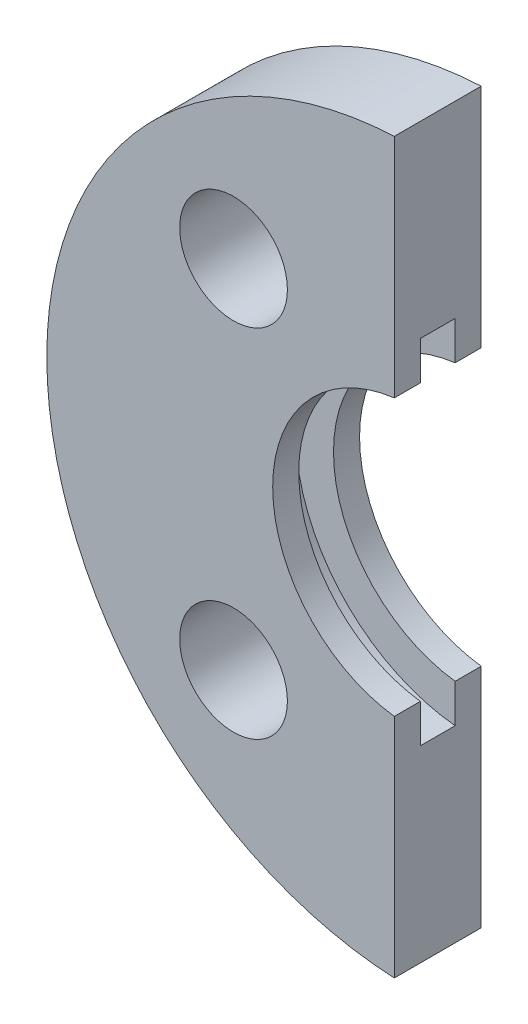
ISO-10303-21;
HEADER;
FILE_DESCRIPTION(('STEP AP214'),'2;1');
FILE_NAME('part.step','',(''),(''),'','','');
FILE_SCHEMA(('AUTOMOTIVE_DESIGN { 1 0 10303 214 1 1 1 1 }'));
ENDSEC;
DATA;
#1=APPLICATION_CONTEXT('core data for automotive mechanical design processes');
#2=APPLICATION_PROTOCOL_DEFINITION('international standard','automotive_design',2000,#1);
#3=PRODUCT_CONTEXT('',#1,'mechanical');
#4=PRODUCT('Part','Part','',(#3));
#5=PRODUCT_RELATED_PRODUCT_CATEGORY('part','',(#4));
#6=PRODUCT_DEFINITION_FORMATION('','',#4);
#7=PRODUCT_DEFINITION_CONTEXT('part definition',#1,'design');
#8=PRODUCT_DEFINITION('design','',#6,#7);
#9=PRODUCT_DEFINITION_SHAPE('','',#8);
#10=(LENGTH_UNIT() NAMED_UNIT(*) SI_UNIT(.MILLI.,.METRE.));
#11=(NAMED_UNIT(*) PLANE_ANGLE_UNIT() SI_UNIT($,.RADIAN.));
#12=(NAMED_UNIT(*) SI_UNIT($,.STERADIAN.) SOLID_ANGLE_UNIT());
#13=UNCERTAINTY_MEASURE_WITH_UNIT(LENGTH_MEASURE(1.E-05),#10,'distance_accuracy_value','');
#14=(GEOMETRIC_REPRESENTATION_CONTEXT(3) GLOBAL_UNCERTAINTY_ASSIGNED_CONTEXT((#13)) GLOBAL_UNIT_ASSIGNED_CONTEXT((#10,
#11,#12)) REPRESENTATION_CONTEXT('',''));
#15=CARTESIAN_POINT('',(0.,0.,0.));
#16=DIRECTION('',(0.,0.,1.));
#17=DIRECTION('',(1.,0.,0.));
#18=AXIS2_PLACEMENT_3D('',#15,#16,#17);
#19=CARTESIAN_POINT('',(0.,0.,5.));
#20=DIRECTION('',(0.,0.,-1.));
#21=DIRECTION('',(-1.,0.,0.));
#22=AXIS2_PLACEMENT_3D('',#19,#20,#21);
#23=CYLINDRICAL_SURFACE('',#22,8.);
#24=CARTESIAN_POINT('',(0.,0.,1.5));
#25=DIRECTION('',(0.,0.,-1.));
#26=DIRECTION('',(-1.,0.,0.));
#27=AXIS2_PLACEMENT_3D('',#24,#25,#26);
#28=CIRCLE('',#27,8.);
#29=CARTESIAN_POINT('',(-1.,-7.93725393319377,1.5));
#30=VERTEX_POINT('',#29);
#31=CARTESIAN_POINT('',(-1.,7.93725393319377,1.5));
#32=VERTEX_POINT('',#31);
#33=EDGE_CURVE('E118',#30,#32,#28,.T.);
#34=ORIENTED_EDGE('',*,*,#33,.F.);
#35=DIRECTION('',(0.,0.,-1.));
#36=VECTOR('',#35,1.);
#37=CARTESIAN_POINT('',(-1.,-7.93725393319377,5.));
#38=LINE('',#37,#36);
#39=CARTESIAN_POINT('',(-1.,-7.93725393319377,0.));
#40=VERTEX_POINT('',#39);
#41=EDGE_CURVE('E195',#40,#30,#38,.F.);
#42=ORIENTED_EDGE('',*,*,#41,.F.);
#43=CARTESIAN_POINT('',(0.,0.,0.));
#44=DIRECTION('',(0.,0.,1.));
#45=DIRECTION('',(1.,0.,0.));
#46=AXIS2_PLACEMENT_3D('',#43,#44,#45);
#47=CIRCLE('',#46,8.);
#48=CARTESIAN_POINT('',(-1.,7.93725393319377,0.));
#49=VERTEX_POINT('',#48);
#50=EDGE_CURVE('E175',#49,#40,#47,.T.);
#51=ORIENTED_EDGE('',*,*,#50,.F.);
#52=DIRECTION('',(0.,0.,-1.));
#53=VECTOR('',#52,1.);
#54=CARTESIAN_POINT('',(-1.,7.93725393319377,5.));
#55=LINE('',#54,#53);
#56=EDGE_CURVE('E198',#32,#49,#55,.T.);
#57=ORIENTED_EDGE('',*,*,#56,.F.);
#58=EDGE_LOOP('',(#34,#42,#51,#57));
#59=FACE_BOUND('',#58,.T.);
#60=ADVANCED_FACE('F45',(#59),#23,.F.);
#61=CARTESIAN_POINT('',(0.,0.,5.));
#62=DIRECTION('',(0.,0.,1.));
#63=DIRECTION('',(1.,0.,0.));
#64=AXIS2_PLACEMENT_3D('',#61,#62,#63);
#65=PLANE('',#64);
#66=DIRECTION('',(0.,-1.,0.));
#67=VECTOR('',#66,1.);
#68=CARTESIAN_POINT('',(-1.,0.,5.));
#69=LINE('',#68,#67);
#70=CARTESIAN_POINT('',(-1.,20.976176963403,5.));
#71=VERTEX_POINT('',#70);
#72=CARTESIAN_POINT('',(-1.,7.93725393319377,5.));
#73=VERTEX_POINT('',#72);
#74=EDGE_CURVE('E69',#71,#73,#69,.T.);
#75=ORIENTED_EDGE('',*,*,#74,.F.);
#76=CARTESIAN_POINT('',(0.,0.,5.));
#77=DIRECTION('',(0.,0.,1.));
#78=DIRECTION('',(1.,0.,0.));
#79=AXIS2_PLACEMENT_3D('',#76,#77,#78);
#80=CIRCLE('',#79,21.);
#81=CARTESIAN_POINT('',(-1.,-20.976176963403,5.));
#82=VERTEX_POINT('',#81);
#83=EDGE_CURVE('E187',#71,#82,#80,.T.);
#84=ORIENTED_EDGE('',*,*,#83,.T.);
#85=CARTESIAN_POINT('',(-1.,-7.93725393319377,5.));
#86=VERTEX_POINT('',#85);
#87=EDGE_CURVE('E148',#86,#82,#69,.T.);
#88=ORIENTED_EDGE('',*,*,#87,.F.);
#89=CARTESIAN_POINT('',(0.,0.,5.));
#90=DIRECTION('',(0.,0.,1.));
#91=DIRECTION('',(1.,0.,0.));
#92=AXIS2_PLACEMENT_3D('',#89,#90,#91);
#93=CIRCLE('',#92,8.);
#94=EDGE_CURVE('E179',#73,#86,#93,.T.);
#95=ORIENTED_EDGE('',*,*,#94,.F.);
#96=EDGE_LOOP('',(#75,#84,#88,#95));
#97=FACE_BOUND('',#96,.T.);
#98=CARTESIAN_POINT('',(-10.2530483272049,-10.2530483272049,5.));
#99=DIRECTION('',(0.,0.,1.));
#100=DIRECTION('',(1.,0.,0.));
#101=AXIS2_PLACEMENT_3D('',#98,#99,#100);
#102=CIRCLE('',#101,3.1);
#103=CARTESIAN_POINT('',(-7.15304832720494,-10.2530483272049,5.));
#104=VERTEX_POINT('',#103);
#105=EDGE_CURVE('E171',#104,#104,#102,.T.);
#106=ORIENTED_EDGE('',*,*,#105,.F.);
#107=EDGE_LOOP('',(#106));
#108=FACE_BOUND('',#107,.T.);
#109=CARTESIAN_POINT('',(-10.2530483272049,10.2530483272049,5.));
#110=DIRECTION('',(0.,0.,1.));
#111=DIRECTION('',(1.,0.,0.));
#112=AXIS2_PLACEMENT_3D('',#109,#110,#111);
#113=CIRCLE('',#112,3.1);
#114=CARTESIAN_POINT('',(-7.15304832720494,10.2530483272049,5.));
#115=VERTEX_POINT('',#114);
#116=EDGE_CURVE('E163',#115,#115,#113,.T.);
#117=ORIENTED_EDGE('',*,*,#116,.F.);
#118=EDGE_LOOP('',(#117));
#119=FACE_BOUND('',#118,.T.);
#120=ADVANCED_FACE('F226',(#97,#108,#119),#65,.T.);
#121=CARTESIAN_POINT('',(0.,0.,0.));
#122=DIRECTION('',(0.,0.,1.));
#123=DIRECTION('',(1.,0.,0.));
#124=AXIS2_PLACEMENT_3D('',#121,#122,#123);
#125=PLANE('',#124);
#126=CARTESIAN_POINT('',(0.,0.,0.));
#127=DIRECTION('',(0.,0.,1.));
#128=DIRECTION('',(1.,0.,0.));
#129=AXIS2_PLACEMENT_3D('',#126,#127,#128);
#130=CIRCLE('',#129,21.);
#131=CARTESIAN_POINT('',(-1.,20.976176963403,0.));
#132=VERTEX_POINT('',#131);
#133=CARTESIAN_POINT('',(-1.,-20.976176963403,0.));
#134=VERTEX_POINT('',#133);
#135=EDGE_CURVE('E183',#132,#134,#130,.T.);
#136=ORIENTED_EDGE('',*,*,#135,.F.);
#137=DIRECTION('',(0.,-1.,0.));
#138=VECTOR('',#137,1.);
#139=CARTESIAN_POINT('',(-1.,0.,0.));
#140=LINE('',#139,#138);
#141=EDGE_CURVE('E154',#132,#49,#140,.T.);
#142=ORIENTED_EDGE('',*,*,#141,.T.);
#143=ORIENTED_EDGE('',*,*,#50,.T.);
#144=EDGE_CURVE('E61',#40,#134,#140,.T.);
#145=ORIENTED_EDGE('',*,*,#144,.T.);
#146=EDGE_LOOP('',(#136,#142,#143,#145));
#147=FACE_BOUND('',#146,.T.);
#148=CARTESIAN_POINT('',(-10.2530483272049,-10.2530483272049,0.));
#149=DIRECTION('',(0.,0.,1.));
#150=DIRECTION('',(1.,0.,0.));
#151=AXIS2_PLACEMENT_3D('',#148,#149,#150);
#152=CIRCLE('',#151,3.1);
#153=CARTESIAN_POINT('',(-7.15304832720494,-10.2530483272049,0.));
#154=VERTEX_POINT('',#153);
#155=EDGE_CURVE('E167',#154,#154,#152,.T.);
#156=ORIENTED_EDGE('',*,*,#155,.T.);
#157=EDGE_LOOP('',(#156));
#158=FACE_BOUND('',#157,.T.);
#159=CARTESIAN_POINT('',(-10.2530483272049,10.2530483272049,0.));
#160=DIRECTION('',(0.,0.,1.));
#161=DIRECTION('',(1.,0.,0.));
#162=AXIS2_PLACEMENT_3D('',#159,#160,#161);
#163=CIRCLE('',#162,3.1);
#164=CARTESIAN_POINT('',(-7.15304832720494,10.2530483272049,0.));
#165=VERTEX_POINT('',#164);
#166=EDGE_CURVE('E162',#165,#165,#163,.T.);
#167=ORIENTED_EDGE('',*,*,#166,.T.);
#168=EDGE_LOOP('',(#167));
#169=FACE_BOUND('',#168,.T.);
#170=ADVANCED_FACE('F206',(#147,#158,#169),#125,.F.);
#171=CARTESIAN_POINT('',(0.,0.,5.));
#172=DIRECTION('',(0.,0.,-1.));
#173=DIRECTION('',(-1.,0.,0.));
#174=AXIS2_PLACEMENT_3D('',#171,#172,#173);
#175=CYLINDRICAL_SURFACE('',#174,21.);
#176=ORIENTED_EDGE('',*,*,#83,.F.);
#177=DIRECTION('',(0.,0.,-1.));
#178=VECTOR('',#177,1.);
#179=CARTESIAN_POINT('',(-1.,20.976176963403,5.));
#180=LINE('',#179,#178);
#181=EDGE_CURVE('E158',#71,#132,#180,.T.);
#182=ORIENTED_EDGE('',*,*,#181,.T.);
#183=ORIENTED_EDGE('',*,*,#135,.T.);
#184=DIRECTION('',(0.,0.,-1.));
#185=VECTOR('',#184,1.);
#186=CARTESIAN_POINT('',(-1.,-20.976176963403,5.));
#187=LINE('',#186,#185);
#188=EDGE_CURVE('E153',#134,#82,#187,.F.);
#189=ORIENTED_EDGE('',*,*,#188,.T.);
#190=EDGE_LOOP('',(#176,#182,#183,#189));
#191=FACE_BOUND('',#190,.T.);
#192=ADVANCED_FACE('F47',(#191),#175,.T.);
#193=CARTESIAN_POINT('',(-1.,-7.93725393319377,3.5));
#194=VERTEX_POINT('',#193);
#195=EDGE_CURVE('E191',#194,#86,#38,.F.);
#196=ORIENTED_EDGE('',*,*,#195,.F.);
#197=CARTESIAN_POINT('',(0.,0.,3.5));
#198=DIRECTION('',(0.,0.,1.));
#199=DIRECTION('',(1.,0.,0.));
#200=AXIS2_PLACEMENT_3D('',#197,#198,#199);
#201=CIRCLE('',#200,8.);
#202=CARTESIAN_POINT('',(-1.,7.93725393319377,3.5));
#203=VERTEX_POINT('',#202);
#204=EDGE_CURVE('E137',#203,#194,#201,.T.);
#205=ORIENTED_EDGE('',*,*,#204,.F.);
#206=EDGE_CURVE('E122',#73,#203,#55,.T.);
#207=ORIENTED_EDGE('',*,*,#206,.F.);
#208=ORIENTED_EDGE('',*,*,#94,.T.);
#209=EDGE_LOOP('',(#196,#205,#207,#208));
#210=FACE_BOUND('',#209,.T.);
#211=ADVANCED_FACE('F221',(#210),#23,.F.);
#212=CARTESIAN_POINT('',(-10.2530483272049,-10.2530483272049,5.));
#213=DIRECTION('',(0.,0.,-1.));
#214=DIRECTION('',(-1.,0.,0.));
#215=AXIS2_PLACEMENT_3D('',#212,#213,#214);
#216=CYLINDRICAL_SURFACE('',#215,3.1);
#217=ORIENTED_EDGE('',*,*,#105,.T.);
#218=EDGE_LOOP('',(#217));
#219=FACE_BOUND('',#218,.T.);
#220=ORIENTED_EDGE('',*,*,#155,.F.);
#221=EDGE_LOOP('',(#220));
#222=FACE_BOUND('',#221,.T.);
#223=ADVANCED_FACE('F236',(#219,#222),#216,.F.);
#224=CARTESIAN_POINT('',(-10.2530483272049,10.2530483272049,5.));
#225=DIRECTION('',(0.,0.,-1.));
#226=DIRECTION('',(-1.,0.,0.));
#227=AXIS2_PLACEMENT_3D('',#224,#225,#226);
#228=CYLINDRICAL_SURFACE('',#227,3.1);
#229=ORIENTED_EDGE('',*,*,#116,.T.);
#230=EDGE_LOOP('',(#229));
#231=FACE_BOUND('',#230,.T.);
#232=ORIENTED_EDGE('',*,*,#166,.F.);
#233=EDGE_LOOP('',(#232));
#234=FACE_BOUND('',#233,.T.);
#235=ADVANCED_FACE('F245',(#231,#234),#228,.F.);
#236=CARTESIAN_POINT('',(-1.,0.,-5.));
#237=DIRECTION('',(-1.,0.,0.));
#238=DIRECTION('',(0.,0.,1.));
#239=AXIS2_PLACEMENT_3D('',#236,#237,#238);
#240=PLANE('',#239);
#241=DIRECTION('',(0.,0.,-1.));
#242=VECTOR('',#241,1.);
#243=CARTESIAN_POINT('',(-1.,-10.1508620323596,3.5));
#244=LINE('',#243,#242);
#245=CARTESIAN_POINT('',(-1.,-10.1508620323596,3.5));
#246=VERTEX_POINT('',#245);
#247=CARTESIAN_POINT('',(-1.,-10.1508620323596,1.5));
#248=VERTEX_POINT('',#247);
#249=EDGE_CURVE('E128',#246,#248,#244,.T.);
#250=ORIENTED_EDGE('',*,*,#249,.F.);
#251=DIRECTION('',(0.,1.,0.));
#252=VECTOR('',#251,1.);
#253=CARTESIAN_POINT('',(-1.,0.,3.5));
#254=LINE('',#253,#252);
#255=EDGE_CURVE('E142',#246,#194,#254,.T.);
#256=ORIENTED_EDGE('',*,*,#255,.T.);
#257=ORIENTED_EDGE('',*,*,#195,.T.);
#258=ORIENTED_EDGE('',*,*,#87,.T.);
#259=ORIENTED_EDGE('',*,*,#188,.F.);
#260=ORIENTED_EDGE('',*,*,#144,.F.);
#261=ORIENTED_EDGE('',*,*,#41,.T.);
#262=DIRECTION('',(0.,1.,0.));
#263=VECTOR('',#262,1.);
#264=CARTESIAN_POINT('',(-1.,0.,1.5));
#265=LINE('',#264,#263);
#266=EDGE_CURVE('E210',#248,#30,#265,.T.);
#267=ORIENTED_EDGE('',*,*,#266,.F.);
#268=EDGE_LOOP('',(#250,#256,#257,#258,#259,#260,#261,#267));
#269=FACE_BOUND('',#268,.T.);
#270=ADVANCED_FACE('F209',(#269),#240,.F.);
#271=DIRECTION('',(0.,-1.,0.));
#272=VECTOR('',#271,1.);
#273=CARTESIAN_POINT('',(-1.,7.20974263617329,3.5));
#274=LINE('',#273,#272);
#275=CARTESIAN_POINT('',(-1.,10.1508620323596,3.5));
#276=VERTEX_POINT('',#275);
#277=EDGE_CURVE('E133',#276,#203,#274,.T.);
#278=ORIENTED_EDGE('',*,*,#277,.F.);
#279=DIRECTION('',(0.,0.,-1.));
#280=VECTOR('',#279,1.);
#281=CARTESIAN_POINT('',(-1.,10.1508620323596,3.5));
#282=LINE('',#281,#280);
#283=CARTESIAN_POINT('',(-1.,10.1508620323596,1.5));
#284=VERTEX_POINT('',#283);
#285=EDGE_CURVE('E11',#284,#276,#282,.F.);
#286=ORIENTED_EDGE('',*,*,#285,.F.);
#287=DIRECTION('',(0.,-1.,0.));
#288=VECTOR('',#287,1.);
#289=CARTESIAN_POINT('',(-1.,0.,1.5));
#290=LINE('',#289,#288);
#291=EDGE_CURVE('E54',#284,#32,#290,.T.);
#292=ORIENTED_EDGE('',*,*,#291,.T.);
#293=ORIENTED_EDGE('',*,*,#56,.T.);
#294=ORIENTED_EDGE('',*,*,#141,.F.);
#295=ORIENTED_EDGE('',*,*,#181,.F.);
#296=ORIENTED_EDGE('',*,*,#74,.T.);
#297=ORIENTED_EDGE('',*,*,#206,.T.);
#298=EDGE_LOOP('',(#278,#286,#292,#293,#294,#295,#296,#297));
#299=FACE_BOUND('',#298,.T.);
#300=ADVANCED_FACE('F132',(#299),#240,.F.);
#301=CARTESIAN_POINT('',(-3.,7.20974263617329,1.5));
#302=DIRECTION('',(0.,0.,-1.));
#303=DIRECTION('',(-1.,0.,0.));
#304=AXIS2_PLACEMENT_3D('',#301,#302,#303);
#305=PLANE('',#304);
#306=ORIENTED_EDGE('',*,*,#291,.F.);
#307=CARTESIAN_POINT('',(0.,0.,1.5));
#308=DIRECTION('',(0.,0.,1.));
#309=DIRECTION('',(1.,0.,0.));
#310=AXIS2_PLACEMENT_3D('',#307,#308,#309);
#311=CIRCLE('',#310,10.2);
#312=EDGE_CURVE('E116',#284,#248,#311,.T.);
#313=ORIENTED_EDGE('',*,*,#312,.T.);
#314=ORIENTED_EDGE('',*,*,#266,.T.);
#315=ORIENTED_EDGE('',*,*,#33,.T.);
#316=EDGE_LOOP('',(#306,#313,#314,#315));
#317=FACE_BOUND('',#316,.T.);
#318=ADVANCED_FACE('F114',(#317),#305,.F.);
#319=CARTESIAN_POINT('',(-3.,7.20974263617329,3.5));
#320=DIRECTION('',(0.,0.,1.));
#321=DIRECTION('',(1.,0.,0.));
#322=AXIS2_PLACEMENT_3D('',#319,#320,#321);
#323=PLANE('',#322);
#324=CARTESIAN_POINT('',(0.,0.,3.5));
#325=DIRECTION('',(0.,0.,1.));
#326=DIRECTION('',(1.,0.,0.));
#327=AXIS2_PLACEMENT_3D('',#324,#325,#326);
#328=CIRCLE('',#327,10.2);
#329=EDGE_CURVE('E130',#276,#246,#328,.T.);
#330=ORIENTED_EDGE('',*,*,#329,.F.);
#331=ORIENTED_EDGE('',*,*,#277,.T.);
#332=ORIENTED_EDGE('',*,*,#204,.T.);
#333=ORIENTED_EDGE('',*,*,#255,.F.);
#334=EDGE_LOOP('',(#330,#331,#332,#333));
#335=FACE_BOUND('',#334,.T.);
#336=ADVANCED_FACE('F217',(#335),#323,.F.);
#337=CARTESIAN_POINT('',(0.,0.,3.5));
#338=DIRECTION('',(0.,0.,-1.));
#339=DIRECTION('',(-1.,0.,0.));
#340=AXIS2_PLACEMENT_3D('',#337,#338,#339);
#341=CYLINDRICAL_SURFACE('',#340,10.2);
#342=ORIENTED_EDGE('',*,*,#249,.T.);
#343=ORIENTED_EDGE('',*,*,#312,.F.);
#344=ORIENTED_EDGE('',*,*,#285,.T.);
#345=ORIENTED_EDGE('',*,*,#329,.T.);
#346=EDGE_LOOP('',(#342,#343,#344,#345));
#347=FACE_BOUND('',#346,.T.);
#348=ADVANCED_FACE('F124',(#347),#341,.F.);
#349=CLOSED_SHELL('',(#60,#120,#170,#192,#211,#223,#235,#270,#300,#318,#336,#348));
#350=MANIFOLD_SOLID_BREP('B2',#349);
#351=ADVANCED_BREP_SHAPE_REPRESENTATION('',(#18,#350),#14);
#352=SHAPE_DEFINITION_REPRESENTATION(#9,#351);
ENDSEC;
END-ISO-10303-21;
